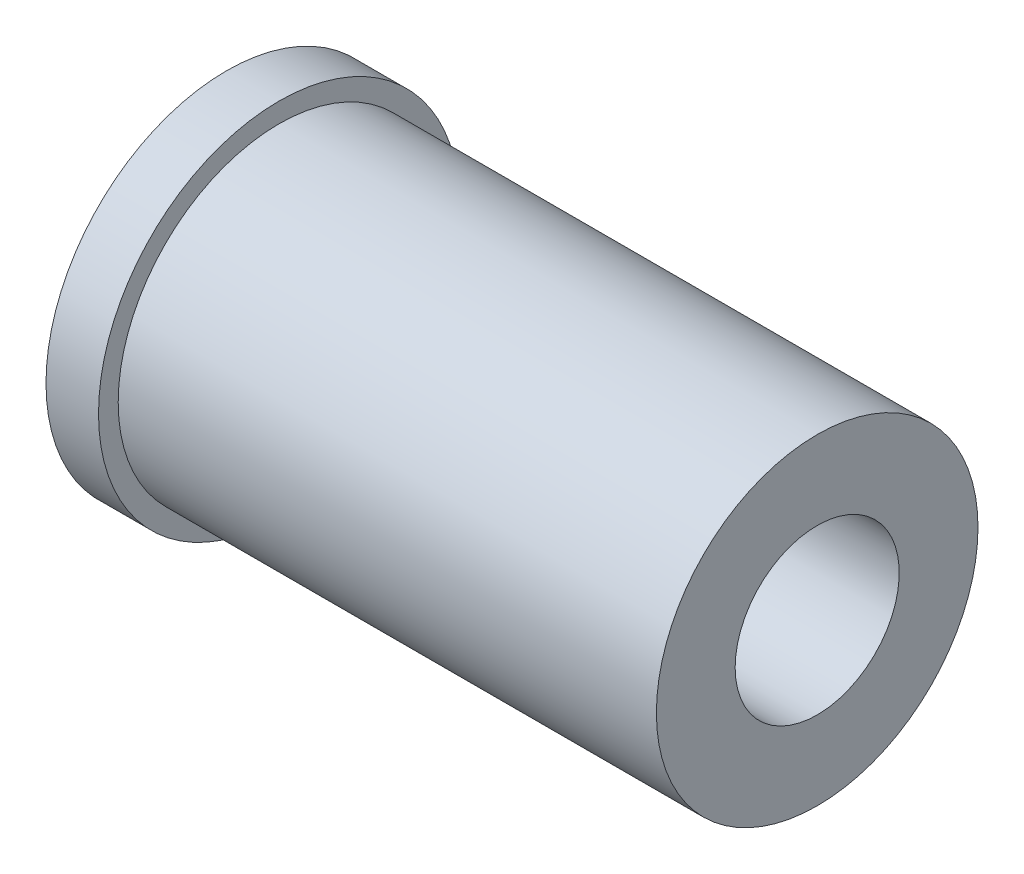
ISO-10303-21;
HEADER;
FILE_DESCRIPTION(('STEP AP214'),'2;1');
FILE_NAME('part.step','',(''),(''),'','','');
FILE_SCHEMA(('AUTOMOTIVE_DESIGN { 1 0 10303 214 1 1 1 1 }'));
ENDSEC;
DATA;
#1=APPLICATION_CONTEXT('core data for automotive mechanical design processes');
#2=APPLICATION_PROTOCOL_DEFINITION('international standard','automotive_design',2000,#1);
#3=PRODUCT_CONTEXT('',#1,'mechanical');
#4=PRODUCT('Part','Part','',(#3));
#5=PRODUCT_RELATED_PRODUCT_CATEGORY('part','',(#4));
#6=PRODUCT_DEFINITION_FORMATION('','',#4);
#7=PRODUCT_DEFINITION_CONTEXT('part definition',#1,'design');
#8=PRODUCT_DEFINITION('design','',#6,#7);
#9=PRODUCT_DEFINITION_SHAPE('','',#8);
#10=(LENGTH_UNIT() NAMED_UNIT(*) SI_UNIT(.MILLI.,.METRE.));
#11=(NAMED_UNIT(*) PLANE_ANGLE_UNIT() SI_UNIT($,.RADIAN.));
#12=(NAMED_UNIT(*) SI_UNIT($,.STERADIAN.) SOLID_ANGLE_UNIT());
#13=UNCERTAINTY_MEASURE_WITH_UNIT(LENGTH_MEASURE(1.E-05),#10,'distance_accuracy_value','');
#14=(GEOMETRIC_REPRESENTATION_CONTEXT(3) GLOBAL_UNCERTAINTY_ASSIGNED_CONTEXT((#13)) GLOBAL_UNIT_ASSIGNED_CONTEXT((#10,
#11,#12)) REPRESENTATION_CONTEXT('',''));
#15=CARTESIAN_POINT('',(0.,0.,0.));
#16=DIRECTION('',(0.,0.,1.));
#17=DIRECTION('',(1.,0.,0.));
#18=AXIS2_PLACEMENT_3D('',#15,#16,#17);
#19=CARTESIAN_POINT('',(0.,0.,0.));
#20=DIRECTION('',(-1.,0.,0.));
#21=DIRECTION('',(0.,0.,1.));
#22=AXIS2_PLACEMENT_3D('',#19,#20,#21);
#23=CYLINDRICAL_SURFACE('',#22,1.5);
#24=CARTESIAN_POINT('',(3.5,0.,0.));
#25=DIRECTION('',(-1.,0.,0.));
#26=DIRECTION('',(0.,0.,1.));
#27=AXIS2_PLACEMENT_3D('',#24,#25,#26);
#28=CIRCLE('',#27,1.5);
#29=CARTESIAN_POINT('',(3.5,0.,1.5));
#30=VERTEX_POINT('',#29);
#31=EDGE_CURVE('E60',#30,#30,#28,.T.);
#32=ORIENTED_EDGE('',*,*,#31,.F.);
#33=EDGE_LOOP('',(#32));
#34=FACE_BOUND('',#33,.T.);
#35=CARTESIAN_POINT('',(0.,0.,0.));
#36=DIRECTION('',(-1.,0.,0.));
#37=DIRECTION('',(0.,0.,1.));
#38=AXIS2_PLACEMENT_3D('',#35,#36,#37);
#39=CIRCLE('',#38,1.5);
#40=CARTESIAN_POINT('',(0.,0.,1.5));
#41=VERTEX_POINT('',#40);
#42=EDGE_CURVE('E10',#41,#41,#39,.T.);
#43=ORIENTED_EDGE('',*,*,#42,.T.);
#44=EDGE_LOOP('',(#43));
#45=FACE_BOUND('',#44,.T.);
#46=ADVANCED_FACE('F38',(#34,#45),#23,.F.);
#47=CARTESIAN_POINT('',(0.,1.5,0.));
#48=DIRECTION('',(1.,0.,0.));
#49=DIRECTION('',(0.,0.,-1.));
#50=AXIS2_PLACEMENT_3D('',#47,#48,#49);
#51=PLANE('',#50);
#52=ORIENTED_EDGE('',*,*,#42,.F.);
#53=EDGE_LOOP('',(#52));
#54=FACE_BOUND('',#53,.T.);
#55=CARTESIAN_POINT('',(0.,0.,0.));
#56=DIRECTION('',(-1.,0.,0.));
#57=DIRECTION('',(0.,0.,1.));
#58=AXIS2_PLACEMENT_3D('',#55,#56,#57);
#59=CIRCLE('',#58,2.75);
#60=CARTESIAN_POINT('',(0.,0.,2.75));
#61=VERTEX_POINT('',#60);
#62=EDGE_CURVE('E44',#61,#61,#59,.T.);
#63=ORIENTED_EDGE('',*,*,#62,.T.);
#64=EDGE_LOOP('',(#63));
#65=FACE_BOUND('',#64,.T.);
#66=ADVANCED_FACE('F80',(#54,#65),#51,.F.);
#67=CARTESIAN_POINT('',(0.,0.,0.));
#68=DIRECTION('',(-1.,0.,0.));
#69=DIRECTION('',(0.,0.,1.));
#70=AXIS2_PLACEMENT_3D('',#67,#68,#69);
#71=CYLINDRICAL_SURFACE('',#70,2.75);
#72=ORIENTED_EDGE('',*,*,#62,.F.);
#73=EDGE_LOOP('',(#72));
#74=FACE_BOUND('',#73,.T.);
#75=CARTESIAN_POINT('',(0.8,0.,0.));
#76=DIRECTION('',(-1.,0.,0.));
#77=DIRECTION('',(0.,0.,1.));
#78=AXIS2_PLACEMENT_3D('',#75,#76,#77);
#79=CIRCLE('',#78,2.75);
#80=CARTESIAN_POINT('',(0.8,0.,2.75));
#81=VERTEX_POINT('',#80);
#82=EDGE_CURVE('E48',#81,#81,#79,.T.);
#83=ORIENTED_EDGE('',*,*,#82,.T.);
#84=EDGE_LOOP('',(#83));
#85=FACE_BOUND('',#84,.T.);
#86=ADVANCED_FACE('F84',(#74,#85),#71,.T.);
#87=CARTESIAN_POINT('',(0.8,2.75,0.));
#88=DIRECTION('',(-1.,0.,0.));
#89=DIRECTION('',(0.,0.,1.));
#90=AXIS2_PLACEMENT_3D('',#87,#88,#89);
#91=PLANE('',#90);
#92=ORIENTED_EDGE('',*,*,#82,.F.);
#93=EDGE_LOOP('',(#92));
#94=FACE_BOUND('',#93,.T.);
#95=CARTESIAN_POINT('',(0.8,0.,0.));
#96=DIRECTION('',(-1.,0.,0.));
#97=DIRECTION('',(0.,0.,1.));
#98=AXIS2_PLACEMENT_3D('',#95,#96,#97);
#99=CIRCLE('',#98,2.45);
#100=CARTESIAN_POINT('',(0.8,0.,2.45));
#101=VERTEX_POINT('',#100);
#102=EDGE_CURVE('E52',#101,#101,#99,.T.);
#103=ORIENTED_EDGE('',*,*,#102,.T.);
#104=EDGE_LOOP('',(#103));
#105=FACE_BOUND('',#104,.T.);
#106=ADVANCED_FACE('F89',(#94,#105),#91,.F.);
#107=CARTESIAN_POINT('',(0.,0.,0.));
#108=DIRECTION('',(-1.,0.,0.));
#109=DIRECTION('',(0.,0.,1.));
#110=AXIS2_PLACEMENT_3D('',#107,#108,#109);
#111=CYLINDRICAL_SURFACE('',#110,2.45);
#112=ORIENTED_EDGE('',*,*,#102,.F.);
#113=EDGE_LOOP('',(#112));
#114=FACE_BOUND('',#113,.T.);
#115=CARTESIAN_POINT('',(9.,0.,0.));
#116=DIRECTION('',(-1.,0.,0.));
#117=DIRECTION('',(0.,0.,1.));
#118=AXIS2_PLACEMENT_3D('',#115,#116,#117);
#119=CIRCLE('',#118,2.45);
#120=CARTESIAN_POINT('',(9.,0.,2.45));
#121=VERTEX_POINT('',#120);
#122=EDGE_CURVE('E57',#121,#121,#119,.T.);
#123=ORIENTED_EDGE('',*,*,#122,.T.);
#124=EDGE_LOOP('',(#123));
#125=FACE_BOUND('',#124,.T.);
#126=ADVANCED_FACE('F95',(#114,#125),#111,.T.);
#127=CARTESIAN_POINT('',(9.,2.45,0.));
#128=DIRECTION('',(-1.,0.,0.));
#129=DIRECTION('',(0.,0.,1.));
#130=AXIS2_PLACEMENT_3D('',#127,#128,#129);
#131=PLANE('',#130);
#132=CARTESIAN_POINT('',(9.,0.,0.));
#133=DIRECTION('',(-1.,0.,0.));
#134=DIRECTION('',(0.,0.,1.));
#135=AXIS2_PLACEMENT_3D('',#132,#133,#134);
#136=CIRCLE('',#135,1.25);
#137=CARTESIAN_POINT('',(9.,0.,1.25));
#138=VERTEX_POINT('',#137);
#139=EDGE_CURVE('E63',#138,#138,#136,.T.);
#140=ORIENTED_EDGE('',*,*,#139,.T.);
#141=EDGE_LOOP('',(#140));
#142=FACE_BOUND('',#141,.T.);
#143=ORIENTED_EDGE('',*,*,#122,.F.);
#144=EDGE_LOOP('',(#143));
#145=FACE_BOUND('',#144,.T.);
#146=ADVANCED_FACE('F75',(#142,#145),#131,.F.);
#147=CARTESIAN_POINT('',(3.5,0.,0.));
#148=DIRECTION('',(1.,0.,0.));
#149=DIRECTION('',(0.,0.,-1.));
#150=AXIS2_PLACEMENT_3D('',#147,#148,#149);
#151=PLANE('',#150);
#152=CARTESIAN_POINT('',(3.5,0.,0.));
#153=DIRECTION('',(-1.,0.,0.));
#154=DIRECTION('',(0.,0.,1.));
#155=AXIS2_PLACEMENT_3D('',#152,#153,#154);
#156=CIRCLE('',#155,1.24999999999999);
#157=CARTESIAN_POINT('',(3.5,0.,1.24999999999999));
#158=VERTEX_POINT('',#157);
#159=EDGE_CURVE('E66',#158,#158,#156,.T.);
#160=ORIENTED_EDGE('',*,*,#159,.F.);
#161=EDGE_LOOP('',(#160));
#162=FACE_BOUND('',#161,.T.);
#163=ORIENTED_EDGE('',*,*,#31,.T.);
#164=EDGE_LOOP('',(#163));
#165=FACE_BOUND('',#164,.T.);
#166=ADVANCED_FACE('F72',(#162,#165),#151,.F.);
#167=CARTESIAN_POINT('',(3.5,0.,0.));
#168=DIRECTION('',(-1.,0.,0.));
#169=DIRECTION('',(0.,0.,1.));
#170=AXIS2_PLACEMENT_3D('',#167,#168,#169);
#171=CYLINDRICAL_SURFACE('',#170,1.24999999999999);
#172=ORIENTED_EDGE('',*,*,#139,.F.);
#173=EDGE_LOOP('',(#172));
#174=FACE_BOUND('',#173,.T.);
#175=ORIENTED_EDGE('',*,*,#159,.T.);
#176=EDGE_LOOP('',(#175));
#177=FACE_BOUND('',#176,.T.);
#178=ADVANCED_FACE('F70',(#174,#177),#171,.F.);
#179=CLOSED_SHELL('',(#46,#66,#86,#106,#126,#146,#166,#178));
#180=MANIFOLD_SOLID_BREP('B2',#179);
#181=ADVANCED_BREP_SHAPE_REPRESENTATION('',(#18,#180),#14);
#182=SHAPE_DEFINITION_REPRESENTATION(#9,#181);
ENDSEC;
END-ISO-10303-21;
